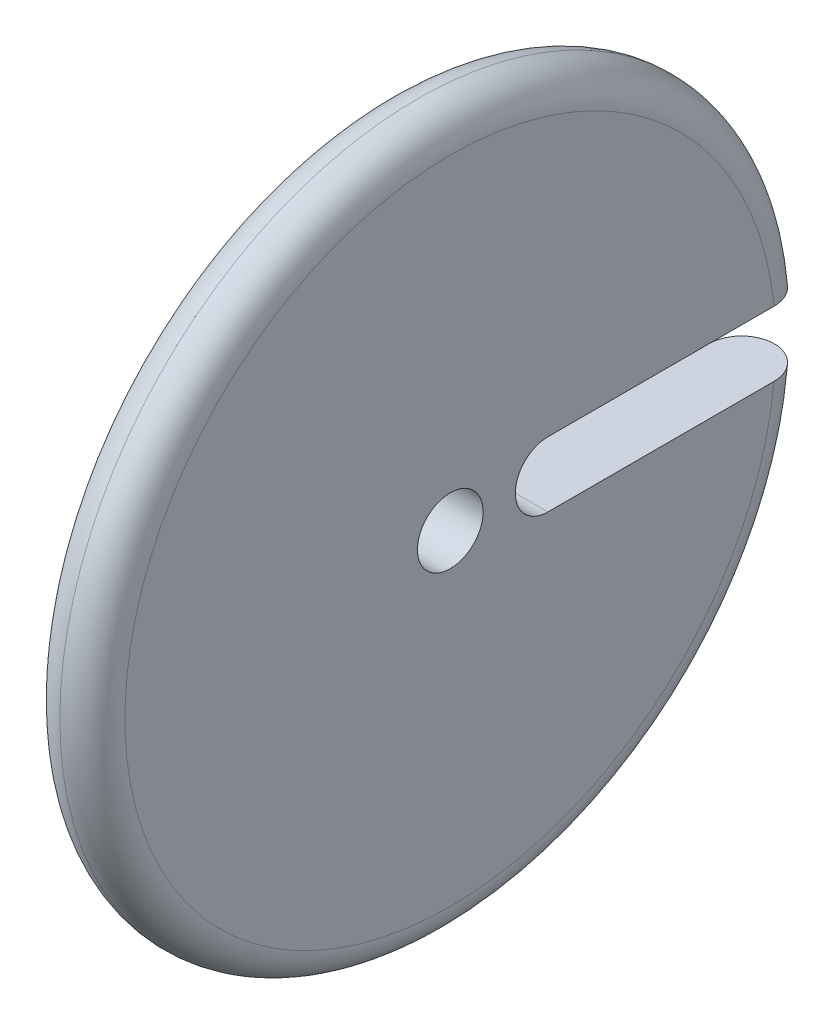
ISO-10303-21;
HEADER;
FILE_DESCRIPTION(('STEP AP214'),'2;1');
FILE_NAME('part.step','',(''),(''),'','','');
FILE_SCHEMA(('AUTOMOTIVE_DESIGN { 1 0 10303 214 1 1 1 1 }'));
ENDSEC;
DATA;
#1=APPLICATION_CONTEXT('core data for automotive mechanical design processes');
#2=APPLICATION_PROTOCOL_DEFINITION('international standard','automotive_design',2000,#1);
#3=PRODUCT_CONTEXT('',#1,'mechanical');
#4=PRODUCT('Part','Part','',(#3));
#5=PRODUCT_RELATED_PRODUCT_CATEGORY('part','',(#4));
#6=PRODUCT_DEFINITION_FORMATION('','',#4);
#7=PRODUCT_DEFINITION_CONTEXT('part definition',#1,'design');
#8=PRODUCT_DEFINITION('design','',#6,#7);
#9=PRODUCT_DEFINITION_SHAPE('','',#8);
#10=(LENGTH_UNIT() NAMED_UNIT(*) SI_UNIT(.MILLI.,.METRE.));
#11=(NAMED_UNIT(*) PLANE_ANGLE_UNIT() SI_UNIT($,.RADIAN.));
#12=(NAMED_UNIT(*) SI_UNIT($,.STERADIAN.) SOLID_ANGLE_UNIT());
#13=UNCERTAINTY_MEASURE_WITH_UNIT(LENGTH_MEASURE(1.E-05),#10,'distance_accuracy_value','');
#14=(GEOMETRIC_REPRESENTATION_CONTEXT(3) GLOBAL_UNCERTAINTY_ASSIGNED_CONTEXT((#13)) GLOBAL_UNIT_ASSIGNED_CONTEXT((#10,
#11,#12)) REPRESENTATION_CONTEXT('',''));
#15=CARTESIAN_POINT('',(0.,0.,0.));
#16=DIRECTION('',(0.,0.,1.));
#17=DIRECTION('',(1.,0.,0.));
#18=AXIS2_PLACEMENT_3D('',#15,#16,#17);
#19=CARTESIAN_POINT('',(10.,0.,0.));
#20=DIRECTION('',(1.,0.,0.));
#21=DIRECTION('',(0.,0.,-1.));
#22=AXIS2_PLACEMENT_3D('',#19,#20,#21);
#23=PLANE('',#22);
#24=CARTESIAN_POINT('',(10.,0.,0.));
#25=DIRECTION('',(1.,0.,0.));
#26=DIRECTION('',(0.,0.,-1.));
#27=AXIS2_PLACEMENT_3D('',#24,#25,#26);
#28=CIRCLE('',#27,5.05);
#29=CARTESIAN_POINT('',(10.,0.,-5.05));
#30=VERTEX_POINT('',#29);
#31=EDGE_CURVE('E121',#30,#30,#28,.T.);
#32=ORIENTED_EDGE('',*,*,#31,.F.);
#33=EDGE_LOOP('',(#32));
#34=FACE_BOUND('',#33,.T.);
#35=DIRECTION('',(0.,0.,1.));
#36=VECTOR('',#35,1.);
#37=CARTESIAN_POINT('',(10.,4.99999999999999,-56.7461095924724));
#38=LINE('',#37,#36);
#39=CARTESIAN_POINT('',(10.,4.99999999999999,-49.749371855331));
#40=VERTEX_POINT('',#39);
#41=CARTESIAN_POINT('',(10.,4.99999999999999,-15.));
#42=VERTEX_POINT('',#41);
#43=EDGE_CURVE('E87',#40,#42,#38,.T.);
#44=ORIENTED_EDGE('',*,*,#43,.F.);
#45=CARTESIAN_POINT('',(10.,0.,0.));
#46=DIRECTION('',(1.,0.,0.));
#47=DIRECTION('',(0.,0.,-1.));
#48=AXIS2_PLACEMENT_3D('',#45,#46,#47);
#49=CIRCLE('',#48,50.);
#50=CARTESIAN_POINT('',(10.,-4.99999999999999,-49.749371855331));
#51=VERTEX_POINT('',#50);
#52=EDGE_CURVE('E128',#40,#51,#49,.T.);
#53=ORIENTED_EDGE('',*,*,#52,.T.);
#54=DIRECTION('',(0.,0.,-1.));
#55=VECTOR('',#54,1.);
#56=CARTESIAN_POINT('',(10.,-4.99999999999999,-56.7461095924724));
#57=LINE('',#56,#55);
#58=CARTESIAN_POINT('',(10.,-5.,-15.));
#59=VERTEX_POINT('',#58);
#60=EDGE_CURVE('E112',#59,#51,#57,.T.);
#61=ORIENTED_EDGE('',*,*,#60,.F.);
#62=CARTESIAN_POINT('',(10.,0.,-15.));
#63=DIRECTION('',(1.,0.,0.));
#64=DIRECTION('',(0.,0.,-1.));
#65=AXIS2_PLACEMENT_3D('',#62,#63,#64);
#66=CIRCLE('',#65,4.99999999999999);
#67=EDGE_CURVE('E98',#42,#59,#66,.T.);
#68=ORIENTED_EDGE('',*,*,#67,.F.);
#69=EDGE_LOOP('',(#44,#53,#61,#68));
#70=FACE_BOUND('',#69,.T.);
#71=ADVANCED_FACE('F39',(#34,#70),#23,.T.);
#72=CARTESIAN_POINT('',(0.,0.,0.));
#73=DIRECTION('',(1.,0.,0.));
#74=DIRECTION('',(0.,0.,-1.));
#75=AXIS2_PLACEMENT_3D('',#72,#73,#74);
#76=PLANE('',#75);
#77=CARTESIAN_POINT('',(0.,0.,0.));
#78=DIRECTION('',(1.,0.,0.));
#79=DIRECTION('',(0.,0.,-1.));
#80=AXIS2_PLACEMENT_3D('',#77,#78,#79);
#81=CIRCLE('',#80,5.05);
#82=CARTESIAN_POINT('',(0.,0.,-5.05));
#83=VERTEX_POINT('',#82);
#84=EDGE_CURVE('E184',#83,#83,#81,.T.);
#85=ORIENTED_EDGE('',*,*,#84,.T.);
#86=EDGE_LOOP('',(#85));
#87=FACE_BOUND('',#86,.T.);
#88=DIRECTION('',(0.,0.,-1.));
#89=VECTOR('',#88,1.);
#90=CARTESIAN_POINT('',(0.,-4.99999999999999,-56.7461095924724));
#91=LINE('',#90,#89);
#92=CARTESIAN_POINT('',(0.,-5.,-15.));
#93=VERTEX_POINT('',#92);
#94=CARTESIAN_POINT('',(0.,-4.99999999999999,-49.749371855331));
#95=VERTEX_POINT('',#94);
#96=EDGE_CURVE('E99',#93,#95,#91,.T.);
#97=ORIENTED_EDGE('',*,*,#96,.T.);
#98=CARTESIAN_POINT('',(0.,0.,0.));
#99=DIRECTION('',(1.,0.,0.));
#100=DIRECTION('',(0.,0.,-1.));
#101=AXIS2_PLACEMENT_3D('',#98,#99,#100);
#102=CIRCLE('',#101,50.);
#103=CARTESIAN_POINT('',(0.,4.99999999999999,-49.749371855331));
#104=VERTEX_POINT('',#103);
#105=EDGE_CURVE('E11',#95,#104,#102,.F.);
#106=ORIENTED_EDGE('',*,*,#105,.T.);
#107=DIRECTION('',(0.,0.,-1.));
#108=VECTOR('',#107,1.);
#109=CARTESIAN_POINT('',(0.,4.99999999999999,0.));
#110=LINE('',#109,#108);
#111=CARTESIAN_POINT('',(0.,4.99999999999999,-15.));
#112=VERTEX_POINT('',#111);
#113=EDGE_CURVE('E107',#112,#104,#110,.T.);
#114=ORIENTED_EDGE('',*,*,#113,.F.);
#115=CARTESIAN_POINT('',(0.,0.,-15.));
#116=DIRECTION('',(1.,0.,0.));
#117=DIRECTION('',(0.,0.,-1.));
#118=AXIS2_PLACEMENT_3D('',#115,#116,#117);
#119=CIRCLE('',#118,4.99999999999999);
#120=EDGE_CURVE('E105',#112,#93,#119,.T.);
#121=ORIENTED_EDGE('',*,*,#120,.T.);
#122=EDGE_LOOP('',(#97,#106,#114,#121));
#123=FACE_BOUND('',#122,.T.);
#124=ADVANCED_FACE('F158',(#87,#123),#76,.F.);
#125=CARTESIAN_POINT('',(10.,4.99999999999999,-56.7461095924724));
#126=DIRECTION('',(0.,-1.,0.));
#127=DIRECTION('',(0.,0.,-1.));
#128=AXIS2_PLACEMENT_3D('',#125,#126,#127);
#129=PLANE('',#128);
#130=CARTESIAN_POINT('',(0.,4.99999999999999,-49.749371855331));
#131=CARTESIAN_POINT('',(-1.47864818765193E-05,4.99999999999999,-49.891143653864));
#132=CARTESIAN_POINT('',(0.00596886104050943,4.99999999999999,-50.0329137975363));
#133=CARTESIAN_POINT('',(0.029829611545676,4.99999999999999,-50.3154450442789));
#134=CARTESIAN_POINT('',(0.0477063088018264,4.99999999999999,-50.4562061816057));
#135=CARTESIAN_POINT('',(0.0952354617022357,4.99999999999999,-50.7356394355151));
#136=CARTESIAN_POINT('',(0.124880828310193,4.99999999999999,-50.8743127576266));
#137=CARTESIAN_POINT('',(0.195740219850726,4.99999999999999,-51.1486693909267));
#138=CARTESIAN_POINT('',(0.236954067734723,4.99999999999999,-51.2843527478407));
#139=CARTESIAN_POINT('',(0.33068633597668,4.99999999999999,-51.5518145628204));
#140=CARTESIAN_POINT('',(0.383208995784591,4.99999999999999,-51.6835915353252));
#141=CARTESIAN_POINT('',(0.499207387943598,4.99999999999999,-51.9422919173459));
#142=CARTESIAN_POINT('',(0.562687149660875,4.99999999999999,-52.0692135202974));
#143=CARTESIAN_POINT('',(0.70010442710175,4.99999999999999,-52.3171675495316));
#144=CARTESIAN_POINT('',(0.774035875926628,4.99999999999999,-52.4382033379609));
#145=CARTESIAN_POINT('',(0.931894201202888,4.99999999999999,-52.6736326050686));
#146=CARTESIAN_POINT('',(1.01582452988564,4.99999999999999,-52.7880237692158));
#147=CARTESIAN_POINT('',(1.19282582274109,4.99999999999999,-53.0089860710995));
#148=CARTESIAN_POINT('',(1.28587109809708,4.99999999999999,-53.1155777869149));
#149=CARTESIAN_POINT('',(1.4806386310628,4.99999999999999,-53.3205146184771));
#150=CARTESIAN_POINT('',(1.58236085130247,4.99999999999999,-53.4188597697367));
#151=CARTESIAN_POINT('',(1.79380221542714,4.99999999999999,-53.6066246311588));
#152=CARTESIAN_POINT('',(1.90352432332346,4.99999999999999,-53.6960410037756));
#153=CARTESIAN_POINT('',(2.13011128470813,4.99999999999999,-53.8652243742792));
#154=CARTESIAN_POINT('',(2.24697359539053,4.99999999999999,-53.944994777535));
#155=CARTESIAN_POINT('',(2.48658377147757,4.99999999999999,-54.0940543200978));
#156=CARTESIAN_POINT('',(2.60930749358417,4.99999999999999,-54.1633822685025));
#157=CARTESIAN_POINT('',(2.8601293421223,4.99999999999999,-54.2913907619088));
#158=CARTESIAN_POINT('',(2.98822546059096,4.99999999999999,-54.3500752420624));
#159=CARTESIAN_POINT('',(3.24888352128389,4.99999999999999,-54.4563825222022));
#160=CARTESIAN_POINT('',(3.38144395147473,4.99999999999999,-54.5040090251565));
#161=CARTESIAN_POINT('',(3.65006643054055,4.99999999999999,-54.5878649044332));
#162=CARTESIAN_POINT('',(3.78612758837918,4.99999999999999,-54.6240971504774));
#163=CARTESIAN_POINT('',(4.10019706741903,4.99999999999999,-54.6936218646424));
#164=CARTESIAN_POINT('',(4.27907114652212,4.99999999999999,-54.72310866871));
#165=CARTESIAN_POINT('',(4.54877116999436,4.99999999999999,-54.7525935834666));
#166=CARTESIAN_POINT('',(4.63885623322882,4.99999999999999,-54.7599643331032));
#167=CARTESIAN_POINT('',(4.81928711305353,4.99999999999999,-54.7697948500767));
#168=CARTESIAN_POINT('',(4.90963290940495,4.99999999999999,-54.7722549888388));
#169=CARTESIAN_POINT('',(5.,4.99999999999999,-54.7722557505166));
#170=B_SPLINE_CURVE_WITH_KNOTS('',3,(#130,#131,#132,#133,#134,#135,#136,#137,#138,#139,#140,
#141,#142,#143,#144,#145,#146,#147,#148,#149,#150,#151,#152,#153,#154,#155,#156,#157,#158,#159,
#160,#161,#162,#163,#164,#165,#166,#167,#168,#169),.UNSPECIFIED.,.F.,.F.,(4,2,2,2,2,2,2,2,2,2,2,
2,2,2,2,2,2,2,2,4),(0.,0.425186905834035,0.850359307330752,1.27527598745708,1.70018616484629,
2.12525591086284,2.55048230641859,2.97546287632505,3.40059060336647,3.82455288883668,
4.24851334846882,4.67263169440004,5.09659987165348,5.51895129431253,5.9411462435164,
6.36319960836575,6.78514659088956,7.32779242495034,7.59883822907195,7.86986353125749),.UNSPECIFIED.);
#171=CARTESIAN_POINT('',(5.,4.99999999999999,-54.7722557505166));
#172=VERTEX_POINT('',#171);
#173=EDGE_CURVE('E62',#104,#172,#170,.T.);
#174=ORIENTED_EDGE('',*,*,#173,.T.);
#175=CARTESIAN_POINT('',(5.,4.99999999999999,-54.7722557505166));
#176=CARTESIAN_POINT('',(5.14019550444754,4.99999999999999,-54.7722712018049));
#177=CARTESIAN_POINT('',(5.2803886441485,4.99999999999999,-54.7663354515297));
#178=CARTESIAN_POINT('',(5.55976886520555,4.99999999999999,-54.742673258837));
#179=CARTESIAN_POINT('',(5.69895600202047,4.99999999999999,-54.724947471469));
#180=CARTESIAN_POINT('',(5.97521906035375,4.99999999999999,-54.6778372919816));
#181=CARTESIAN_POINT('',(6.11229670515454,4.99999999999999,-54.6484630054711));
#182=CARTESIAN_POINT('',(6.38348927165441,4.99999999999999,-54.5782742939449));
#183=CARTESIAN_POINT('',(6.51760422527039,4.99999999999999,-54.5374599922367));
#184=CARTESIAN_POINT('',(6.78195664438858,4.99999999999999,-54.4446736918988));
#185=CARTESIAN_POINT('',(6.91219308339974,4.99999999999999,-54.392698768853));
#186=CARTESIAN_POINT('',(7.16787752662739,4.99999999999999,-54.2779530553701));
#187=CARTESIAN_POINT('',(7.2933237436784,4.99999999999999,-54.2151782828292));
#188=CARTESIAN_POINT('',(7.5384277206462,4.99999999999999,-54.0793350155828));
#189=CARTESIAN_POINT('',(7.65808844453327,4.99999999999999,-54.0062718684224));
#190=CARTESIAN_POINT('',(7.8908930338029,4.99999999999999,-53.8503245443607));
#191=CARTESIAN_POINT('',(8.00403447713952,4.99999999999999,-53.7674367519217));
#192=CARTESIAN_POINT('',(8.22310739456206,4.99999999999999,-53.5923391228819));
#193=CARTESIAN_POINT('',(8.32902897581794,4.99999999999999,-53.5001169092841));
#194=CARTESIAN_POINT('',(8.53279241936309,4.99999999999999,-53.3070689385171));
#195=CARTESIAN_POINT('',(8.63063126246735,4.99999999999999,-53.2062399947722));
#196=CARTESIAN_POINT('',(8.81748826489384,4.99999999999999,-52.9967465956389));
#197=CARTESIAN_POINT('',(8.90650790356585,4.99999999999999,-52.888083459674));
#198=CARTESIAN_POINT('',(9.07515865365523,4.99999999999999,-52.6636404449856));
#199=CARTESIAN_POINT('',(9.15478639958348,4.99999999999999,-52.5478580376173));
#200=CARTESIAN_POINT('',(9.30436412157524,4.99999999999999,-52.3095598924648));
#201=CARTESIAN_POINT('',(9.37427442491678,4.99999999999999,-52.1870192499021));
#202=CARTESIAN_POINT('',(9.50355846792282,4.99999999999999,-51.9365010540124));
#203=CARTESIAN_POINT('',(9.56293210999953,4.99999999999999,-51.8085234503433));
#204=CARTESIAN_POINT('',(9.67071208367052,4.99999999999999,-51.5480880789156));
#205=CARTESIAN_POINT('',(9.719123011575,4.99999999999999,-51.4156322156168));
#206=CARTESIAN_POINT('',(9.80466804164632,4.99999999999999,-51.1471792616673));
#207=CARTESIAN_POINT('',(9.84180445637193,4.99999999999999,-51.011182903443));
#208=CARTESIAN_POINT('',(9.9153127229427,4.99999999999999,-50.6894672602965));
#209=CARTESIAN_POINT('',(9.94707177300241,4.99999999999999,-50.5026621568287));
#210=CARTESIAN_POINT('',(9.97882635398551,4.99999999999999,-50.2209077430956));
#211=CARTESIAN_POINT('',(9.98676387626888,4.99999999999999,-50.1267792916479));
#212=CARTESIAN_POINT('',(9.99734995808821,4.99999999999999,-49.9382325300739));
#213=CARTESIAN_POINT('',(9.99999891737141,4.99999999999999,-49.8438142423958));
#214=CARTESIAN_POINT('',(10.,4.99999999999999,-49.749371855331));
#215=B_SPLINE_CURVE_WITH_KNOTS('',3,(#175,#176,#177,#178,#179,#180,#181,#182,#183,#184,#185,
#186,#187,#188,#189,#190,#191,#192,#193,#194,#195,#196,#197,#198,#199,#200,#201,#202,#203,#204,
#205,#206,#207,#208,#209,#210,#211,#212,#213,#214),.UNSPECIFIED.,.F.,.F.,(4,2,2,2,2,2,2,2,2,2,2,
2,2,2,2,2,2,2,2,4),(0.,0.420457541199874,0.840891723906395,1.26096195578989,1.68102766007101,
2.1012035687226,2.52153473732876,2.94164823309548,3.36191681638337,3.78275014332335,
4.20373996206168,4.62465904318923,5.04572850106043,5.46846948095859,5.89121437596792,
6.31378169824515,6.73626228746365,7.30335547479261,7.58661877105478,7.86986065544994),.UNSPECIFIED.);
#216=EDGE_CURVE('E50',#172,#40,#215,.T.);
#217=ORIENTED_EDGE('',*,*,#216,.T.);
#218=ORIENTED_EDGE('',*,*,#43,.T.);
#219=DIRECTION('',(-1.,0.,0.));
#220=VECTOR('',#219,1.);
#221=CARTESIAN_POINT('',(10.,4.99999999999999,-15.));
#222=LINE('',#221,#220);
#223=EDGE_CURVE('E90',#42,#112,#222,.T.);
#224=ORIENTED_EDGE('',*,*,#223,.T.);
#225=ORIENTED_EDGE('',*,*,#113,.T.);
#226=EDGE_LOOP('',(#174,#217,#218,#224,#225));
#227=FACE_BOUND('',#226,.T.);
#228=ADVANCED_FACE('F89',(#227),#129,.T.);
#229=CARTESIAN_POINT('',(10.,-4.99999999999999,-56.7461095924724));
#230=DIRECTION('',(0.,1.,0.));
#231=DIRECTION('',(0.,0.,1.));
#232=AXIS2_PLACEMENT_3D('',#229,#230,#231);
#233=PLANE('',#232);
#234=ORIENTED_EDGE('',*,*,#60,.T.);
#235=CARTESIAN_POINT('',(10.,-4.99999999999999,-49.749371855331));
#236=CARTESIAN_POINT('',(10.0000147864819,-4.99999999999999,-49.891143653864));
#237=CARTESIAN_POINT('',(9.99403113895949,-4.99999999999999,-50.0329137975363));
#238=CARTESIAN_POINT('',(9.97017038845432,-4.99999999999999,-50.3154450442789));
#239=CARTESIAN_POINT('',(9.95229369119817,-4.99999999999999,-50.4562061816057));
#240=CARTESIAN_POINT('',(9.90476453829776,-4.99999999999999,-50.7356394355151));
#241=CARTESIAN_POINT('',(9.87511917168981,-4.99999999999999,-50.8743127576266));
#242=CARTESIAN_POINT('',(9.80425978014928,-4.99999999999999,-51.1486693909267));
#243=CARTESIAN_POINT('',(9.76304593226528,-4.99999999999999,-51.2843527478407));
#244=CARTESIAN_POINT('',(9.66931366402332,-4.99999999999999,-51.5518145628204));
#245=CARTESIAN_POINT('',(9.61679100421541,-4.99999999999999,-51.6835915353252));
#246=CARTESIAN_POINT('',(9.5007926120564,-4.99999999999999,-51.9422919173459));
#247=CARTESIAN_POINT('',(9.43731285033913,-4.99999999999999,-52.0692135202974));
#248=CARTESIAN_POINT('',(9.29989557289825,-4.99999999999999,-52.3171675495316));
#249=CARTESIAN_POINT('',(9.22596412407337,-4.99999999999999,-52.4382033379609));
#250=CARTESIAN_POINT('',(9.06810579879711,-4.99999999999999,-52.6736326050686));
#251=CARTESIAN_POINT('',(8.98417547011436,-4.99999999999999,-52.7880237692158));
#252=CARTESIAN_POINT('',(8.80717417725891,-4.99999999999999,-53.0089860710995));
#253=CARTESIAN_POINT('',(8.71412890190292,-4.99999999999999,-53.1155777869149));
#254=CARTESIAN_POINT('',(8.5193613689372,-4.99999999999999,-53.3205146184771));
#255=CARTESIAN_POINT('',(8.41763914869753,-4.99999999999999,-53.4188597697367));
#256=CARTESIAN_POINT('',(8.20619778457286,-4.99999999999999,-53.6066246311588));
#257=CARTESIAN_POINT('',(8.09647567667655,-4.99999999999999,-53.6960410037756));
#258=CARTESIAN_POINT('',(7.86988871529188,-4.99999999999999,-53.8652243742792));
#259=CARTESIAN_POINT('',(7.75302640460947,-4.99999999999999,-53.944994777535));
#260=CARTESIAN_POINT('',(7.51341622852244,-4.99999999999999,-54.0940543200978));
#261=CARTESIAN_POINT('',(7.39069250641584,-4.99999999999999,-54.1633822685025));
#262=CARTESIAN_POINT('',(7.1398706578777,-4.99999999999999,-54.2913907619088));
#263=CARTESIAN_POINT('',(7.01177453940904,-4.99999999999999,-54.3500752420624));
#264=CARTESIAN_POINT('',(6.75111647871611,-4.99999999999999,-54.4563825222022));
#265=CARTESIAN_POINT('',(6.61855604852527,-4.99999999999999,-54.5040090251565));
#266=CARTESIAN_POINT('',(6.34993356945944,-4.99999999999999,-54.5878649044332));
#267=CARTESIAN_POINT('',(6.21387241162082,-4.99999999999999,-54.6240971504774));
#268=CARTESIAN_POINT('',(5.89980293258097,-4.99999999999999,-54.6936218646424));
#269=CARTESIAN_POINT('',(5.72092885347789,-4.99999999999999,-54.72310866871));
#270=CARTESIAN_POINT('',(5.45122883000564,-4.99999999999999,-54.7525935834666));
#271=CARTESIAN_POINT('',(5.36114376677118,-4.99999999999999,-54.7599643331032));
#272=CARTESIAN_POINT('',(5.18071288694647,-4.99999999999999,-54.7697948500767));
#273=CARTESIAN_POINT('',(5.09036709059506,-4.99999999999999,-54.7722549888388));
#274=CARTESIAN_POINT('',(5.,-4.99999999999999,-54.7722557505166));
#275=B_SPLINE_CURVE_WITH_KNOTS('',3,(#235,#236,#237,#238,#239,#240,#241,#242,#243,#244,#245,
#246,#247,#248,#249,#250,#251,#252,#253,#254,#255,#256,#257,#258,#259,#260,#261,#262,#263,#264,
#265,#266,#267,#268,#269,#270,#271,#272,#273,#274),.UNSPECIFIED.,.F.,.F.,(4,2,2,2,2,2,2,2,2,2,2,
2,2,2,2,2,2,2,2,4),(0.,0.425186905834035,0.850359307330752,1.27527598745707,1.70018616484629,
2.12525591086284,2.5504823064186,2.97546287632505,3.40059060336648,3.82455288883668,
4.24851334846882,4.67263169440004,5.09659987165347,5.51895129431252,5.9411462435164,
6.36319960836575,6.78514659088956,7.32779242495034,7.59883822907194,7.86986353125749),.UNSPECIFIED.);
#276=CARTESIAN_POINT('',(5.,-4.99999999999999,-54.7722557505166));
#277=VERTEX_POINT('',#276);
#278=EDGE_CURVE('E139',#51,#277,#275,.T.);
#279=ORIENTED_EDGE('',*,*,#278,.T.);
#280=CARTESIAN_POINT('',(5.,-4.99999999999999,-54.7722557505166));
#281=CARTESIAN_POINT('',(4.85980449555246,-4.99999999999999,-54.7722712018049));
#282=CARTESIAN_POINT('',(4.7196113558515,-4.99999999999999,-54.7663354515297));
#283=CARTESIAN_POINT('',(4.44023113479445,-4.99999999999999,-54.742673258837));
#284=CARTESIAN_POINT('',(4.30104399797953,-4.99999999999999,-54.724947471469));
#285=CARTESIAN_POINT('',(4.02478093964625,-4.99999999999999,-54.6778372919816));
#286=CARTESIAN_POINT('',(3.88770329484546,-4.99999999999999,-54.6484630054711));
#287=CARTESIAN_POINT('',(3.61651072834559,-4.99999999999999,-54.5782742939449));
#288=CARTESIAN_POINT('',(3.48239577472961,-4.99999999999999,-54.5374599922367));
#289=CARTESIAN_POINT('',(3.21804335561141,-4.99999999999999,-54.4446736918988));
#290=CARTESIAN_POINT('',(3.08780691660025,-4.99999999999999,-54.392698768853));
#291=CARTESIAN_POINT('',(2.8321224733726,-4.99999999999999,-54.2779530553701));
#292=CARTESIAN_POINT('',(2.7066762563216,-4.99999999999999,-54.2151782828292));
#293=CARTESIAN_POINT('',(2.4615722793538,-4.99999999999999,-54.0793350155828));
#294=CARTESIAN_POINT('',(2.34191155546673,-4.99999999999999,-54.0062718684224));
#295=CARTESIAN_POINT('',(2.10910696619709,-4.99999999999999,-53.8503245443607));
#296=CARTESIAN_POINT('',(1.99596552286049,-4.99999999999999,-53.7674367519217));
#297=CARTESIAN_POINT('',(1.77689260543794,-4.99999999999999,-53.5923391228819));
#298=CARTESIAN_POINT('',(1.67097102418207,-4.99999999999999,-53.5001169092841));
#299=CARTESIAN_POINT('',(1.46720758063691,-4.99999999999999,-53.3070689385172));
#300=CARTESIAN_POINT('',(1.36936873753265,-4.99999999999999,-53.2062399947722));
#301=CARTESIAN_POINT('',(1.18251173510616,-4.99999999999999,-52.9967465956389));
#302=CARTESIAN_POINT('',(1.09349209643415,-4.99999999999999,-52.888083459674));
#303=CARTESIAN_POINT('',(0.924841346344765,-4.99999999999999,-52.6636404449856));
#304=CARTESIAN_POINT('',(0.845213600416515,-4.99999999999999,-52.5478580376173));
#305=CARTESIAN_POINT('',(0.695635878424758,-4.99999999999999,-52.3095598924648));
#306=CARTESIAN_POINT('',(0.625725575083221,-4.99999999999999,-52.1870192499021));
#307=CARTESIAN_POINT('',(0.496441532077187,-4.99999999999999,-51.9365010540124));
#308=CARTESIAN_POINT('',(0.437067890000468,-4.99999999999999,-51.8085234503433));
#309=CARTESIAN_POINT('',(0.329287916329474,-4.99999999999999,-51.5480880789156));
#310=CARTESIAN_POINT('',(0.280876988425001,-4.99999999999999,-51.4156322156168));
#311=CARTESIAN_POINT('',(0.195331958353685,-4.99999999999999,-51.1471792616673));
#312=CARTESIAN_POINT('',(0.158195543628069,-4.99999999999999,-51.011182903443));
#313=CARTESIAN_POINT('',(0.0846872770573008,-4.99999999999999,-50.6894672602965));
#314=CARTESIAN_POINT('',(0.0529282269975857,-4.99999999999999,-50.5026621568287));
#315=CARTESIAN_POINT('',(0.021173646014494,-4.99999999999999,-50.2209077430956));
#316=CARTESIAN_POINT('',(0.0132361237311155,-4.99999999999999,-50.1267792916479));
#317=CARTESIAN_POINT('',(0.0026500419117832,-4.99999999999999,-49.9382325300739));
#318=CARTESIAN_POINT('',(1.082628592706E-06,-4.99999999999999,-49.8438142423958));
#319=CARTESIAN_POINT('',(0.,-4.99999999999999,-49.749371855331));
#320=B_SPLINE_CURVE_WITH_KNOTS('',3,(#280,#281,#282,#283,#284,#285,#286,#287,#288,#289,#290,
#291,#292,#293,#294,#295,#296,#297,#298,#299,#300,#301,#302,#303,#304,#305,#306,#307,#308,#309,
#310,#311,#312,#313,#314,#315,#316,#317,#318,#319),.UNSPECIFIED.,.F.,.F.,(4,2,2,2,2,2,2,2,2,2,2,
2,2,2,2,2,2,2,2,4),(0.,0.420457541199873,0.840891723906394,1.26096195578989,1.68102766007101,
2.10120356872261,2.52153473732876,2.94164823309548,3.36191681638336,3.78275014332334,
4.20373996206168,4.62465904318923,5.04572850106043,5.4684694809586,5.89121437596792,
6.31378169824515,6.73626228746365,7.30335547479261,7.58661877105478,7.86986065544994),.UNSPECIFIED.);
#321=EDGE_CURVE('E131',#277,#95,#320,.T.);
#322=ORIENTED_EDGE('',*,*,#321,.T.);
#323=ORIENTED_EDGE('',*,*,#96,.F.);
#324=DIRECTION('',(-1.,0.,0.));
#325=VECTOR('',#324,1.);
#326=CARTESIAN_POINT('',(10.,-5.,-15.));
#327=LINE('',#326,#325);
#328=EDGE_CURVE('E108',#59,#93,#327,.T.);
#329=ORIENTED_EDGE('',*,*,#328,.F.);
#330=EDGE_LOOP('',(#234,#279,#322,#323,#329));
#331=FACE_BOUND('',#330,.T.);
#332=ADVANCED_FACE('F145',(#331),#233,.T.);
#333=CARTESIAN_POINT('',(10.,0.,-15.));
#334=DIRECTION('',(-1.,0.,0.));
#335=DIRECTION('',(0.,0.,1.));
#336=AXIS2_PLACEMENT_3D('',#333,#334,#335);
#337=CYLINDRICAL_SURFACE('',#336,4.99999999999999);
#338=ORIENTED_EDGE('',*,*,#120,.F.);
#339=ORIENTED_EDGE('',*,*,#223,.F.);
#340=ORIENTED_EDGE('',*,*,#67,.T.);
#341=ORIENTED_EDGE('',*,*,#328,.T.);
#342=EDGE_LOOP('',(#338,#339,#340,#341));
#343=FACE_BOUND('',#342,.T.);
#344=ADVANCED_FACE('F102',(#343),#337,.F.);
#345=CARTESIAN_POINT('',(10.,0.,0.));
#346=DIRECTION('',(-1.,0.,0.));
#347=DIRECTION('',(0.,0.,1.));
#348=AXIS2_PLACEMENT_3D('',#345,#346,#347);
#349=CYLINDRICAL_SURFACE('',#348,5.05);
#350=ORIENTED_EDGE('',*,*,#31,.T.);
#351=EDGE_LOOP('',(#350));
#352=FACE_BOUND('',#351,.T.);
#353=ORIENTED_EDGE('',*,*,#84,.F.);
#354=EDGE_LOOP('',(#353));
#355=FACE_BOUND('',#354,.T.);
#356=ADVANCED_FACE('F151',(#352,#355),#349,.F.);
#357=CARTESIAN_POINT('',(5.,0.,0.));
#358=DIRECTION('',(1.,0.,0.));
#359=DIRECTION('',(0.,0.,-1.));
#360=AXIS2_PLACEMENT_3D('',#357,#358,#359);
#361=TOROIDAL_SURFACE('',#360,50.,5.);
#362=CARTESIAN_POINT('',(5.,0.,0.));
#363=DIRECTION('',(1.,0.,0.));
#364=DIRECTION('',(0.,0.,-1.));
#365=AXIS2_PLACEMENT_3D('',#362,#363,#364);
#366=CIRCLE('',#365,55.);
#367=EDGE_CURVE('E44',#172,#277,#366,.T.);
#368=ORIENTED_EDGE('',*,*,#367,.F.);
#369=ORIENTED_EDGE('',*,*,#173,.F.);
#370=ORIENTED_EDGE('',*,*,#105,.F.);
#371=ORIENTED_EDGE('',*,*,#321,.F.);
#372=EDGE_LOOP('',(#368,#369,#370,#371));
#373=FACE_BOUND('',#372,.T.);
#374=ADVANCED_FACE('F41',(#373),#361,.T.);
#375=CARTESIAN_POINT('',(5.,0.,0.));
#376=DIRECTION('',(1.,0.,0.));
#377=DIRECTION('',(0.,0.,-1.));
#378=AXIS2_PLACEMENT_3D('',#375,#376,#377);
#379=TOROIDAL_SURFACE('',#378,50.,5.);
#380=ORIENTED_EDGE('',*,*,#216,.F.);
#381=ORIENTED_EDGE('',*,*,#367,.T.);
#382=ORIENTED_EDGE('',*,*,#278,.F.);
#383=ORIENTED_EDGE('',*,*,#52,.F.);
#384=EDGE_LOOP('',(#380,#381,#382,#383));
#385=FACE_BOUND('',#384,.T.);
#386=ADVANCED_FACE('F171',(#385),#379,.T.);
#387=CLOSED_SHELL('',(#71,#124,#228,#332,#344,#356,#374,#386));
#388=MANIFOLD_SOLID_BREP('B2',#387);
#389=ADVANCED_BREP_SHAPE_REPRESENTATION('',(#18,#388),#14);
#390=SHAPE_DEFINITION_REPRESENTATION(#9,#389);
ENDSEC;
END-ISO-10303-21;
